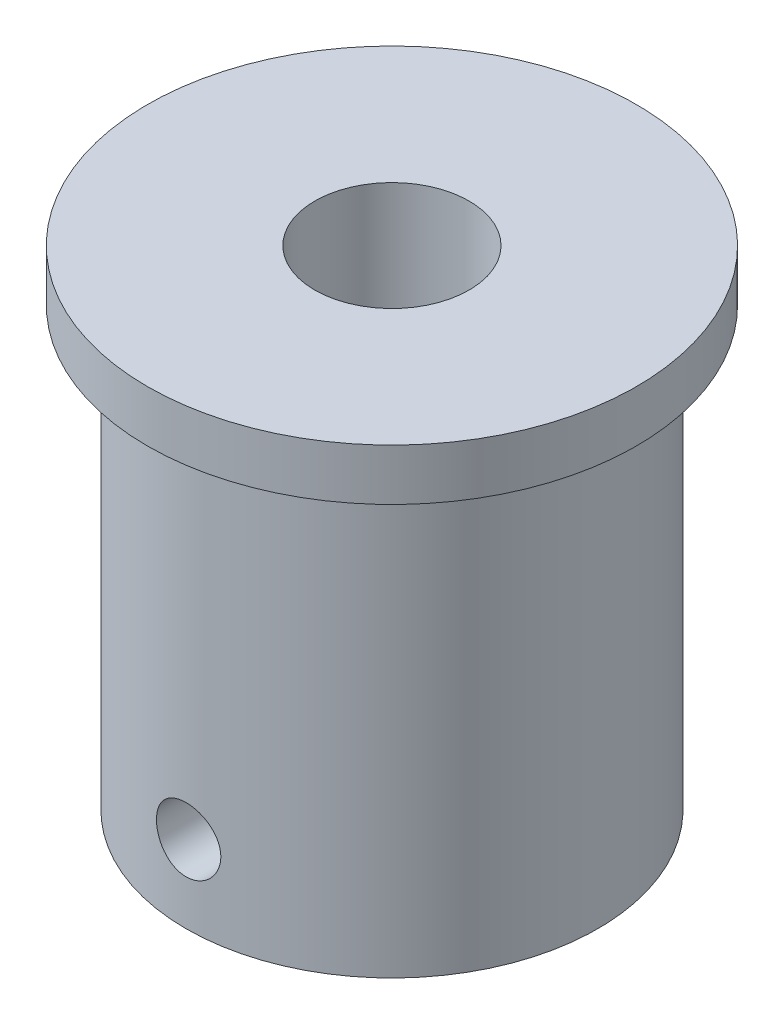
ISO-10303-21;
HEADER;
FILE_DESCRIPTION(('STEP AP214'),'2;1');
FILE_NAME('part.step','',(''),(''),'','','');
FILE_SCHEMA(('AUTOMOTIVE_DESIGN { 1 0 10303 214 1 1 1 1 }'));
ENDSEC;
DATA;
#1=APPLICATION_CONTEXT('core data for automotive mechanical design processes');
#2=APPLICATION_PROTOCOL_DEFINITION('international standard','automotive_design',2000,#1);
#3=PRODUCT_CONTEXT('',#1,'mechanical');
#4=PRODUCT('Part','Part','',(#3));
#5=PRODUCT_RELATED_PRODUCT_CATEGORY('part','',(#4));
#6=PRODUCT_DEFINITION_FORMATION('','',#4);
#7=PRODUCT_DEFINITION_CONTEXT('part definition',#1,'design');
#8=PRODUCT_DEFINITION('design','',#6,#7);
#9=PRODUCT_DEFINITION_SHAPE('','',#8);
#10=(LENGTH_UNIT() NAMED_UNIT(*) SI_UNIT(.MILLI.,.METRE.));
#11=(NAMED_UNIT(*) PLANE_ANGLE_UNIT() SI_UNIT($,.RADIAN.));
#12=(NAMED_UNIT(*) SI_UNIT($,.STERADIAN.) SOLID_ANGLE_UNIT());
#13=UNCERTAINTY_MEASURE_WITH_UNIT(LENGTH_MEASURE(1.E-05),#10,'distance_accuracy_value','');
#14=(GEOMETRIC_REPRESENTATION_CONTEXT(3) GLOBAL_UNCERTAINTY_ASSIGNED_CONTEXT((#13)) GLOBAL_UNIT_ASSIGNED_CONTEXT((#10,
#11,#12)) REPRESENTATION_CONTEXT('',''));
#15=CARTESIAN_POINT('',(0.,0.,0.));
#16=DIRECTION('',(0.,0.,1.));
#17=DIRECTION('',(1.,0.,0.));
#18=AXIS2_PLACEMENT_3D('',#15,#16,#17);
#19=CARTESIAN_POINT('',(0.,8.5,0.));
#20=DIRECTION('',(0.,-1.,0.));
#21=DIRECTION('',(0.,0.,-1.));
#22=AXIS2_PLACEMENT_3D('',#19,#20,#21);
#23=CYLINDRICAL_SURFACE('',#22,4.);
#24=CARTESIAN_POINT('',(0.,2.12499999999999,-4.));
#25=CARTESIAN_POINT('',(-0.0348787743177578,2.12499857543211,-3.99999942548621));
#26=CARTESIAN_POINT('',(-0.0697773512164251,2.1220704715566,-3.99953903121435));
#27=CARTESIAN_POINT('',(-0.138597828744524,2.1104390771808,-3.99774674524398));
#28=CARTESIAN_POINT('',(-0.172518765330827,2.10173027687411,-3.9964140221118));
#29=CARTESIAN_POINT('',(-0.238378134511848,2.07880508429834,-3.99302674291444));
#30=CARTESIAN_POINT('',(-0.270318088072472,2.06459297965959,-3.99097274890793));
#31=CARTESIAN_POINT('',(-0.331355312761145,2.03107536371459,-3.98636948509539));
#32=CARTESIAN_POINT('',(-0.360452952592072,2.01177051424101,-3.98382027965638));
#33=CARTESIAN_POINT('',(-0.415229977912899,1.9684417379115,-3.97848567103589));
#34=CARTESIAN_POINT('',(-0.440881869785655,1.94438325127743,-3.97569862848084));
#35=CARTESIAN_POINT('',(-0.487801922057051,1.89230451293277,-3.97021519032572));
#36=CARTESIAN_POINT('',(-0.509069821635473,1.86428402567495,-3.96751880012687));
#37=CARTESIAN_POINT('',(-0.546726360822202,1.80489043216406,-3.96250607031861));
#38=CARTESIAN_POINT('',(-0.563088183894971,1.77350012940955,-3.96019184946526));
#39=CARTESIAN_POINT('',(-0.590296703992654,1.70837464728555,-3.95622800435591));
#40=CARTESIAN_POINT('',(-0.60114372752515,1.67463960687236,-3.95457834075554));
#41=CARTESIAN_POINT('',(-0.616928898305409,1.60607227471405,-3.95214658627759));
#42=CARTESIAN_POINT('',(-0.62191426371873,1.5712511035453,-3.95135756633091));
#43=CARTESIAN_POINT('',(-0.625980924394045,1.50125820277684,-3.95071542767944));
#44=CARTESIAN_POINT('',(-0.625062587151156,1.46608649513349,-3.95086225072006));
#45=CARTESIAN_POINT('',(-0.617386452022216,1.39672574203683,-3.95206887613802));
#46=CARTESIAN_POINT('',(-0.610681407399224,1.36253069416171,-3.95312043046236));
#47=CARTESIAN_POINT('',(-0.59170484458437,1.29575699841017,-3.95600514086368));
#48=CARTESIAN_POINT('',(-0.579433156710322,1.26317839983987,-3.95783832076603));
#49=CARTESIAN_POINT('',(-0.549617292373453,1.20040282183072,-3.96208876713655));
#50=CARTESIAN_POINT('',(-0.532050930788864,1.17021655205674,-3.96450848271811));
#51=CARTESIAN_POINT('',(-0.492160145366586,1.11320011607862,-3.96965761537525));
#52=CARTESIAN_POINT('',(-0.469835383132534,1.08637018877814,-3.97238705447053));
#53=CARTESIAN_POINT('',(-0.420772722055826,1.03652243834168,-3.97788446562224));
#54=CARTESIAN_POINT('',(-0.393989501401342,1.01354921043264,-3.98065253408898));
#55=CARTESIAN_POINT('',(-0.336924236844835,0.972416713590033,-3.98588781336956));
#56=CARTESIAN_POINT('',(-0.306642175170325,0.954257469110801,-3.98835502265506));
#57=CARTESIAN_POINT('',(-0.243398981764119,0.92326548164441,-3.99271349756759));
#58=CARTESIAN_POINT('',(-0.210436046560112,0.910436360366758,-3.99460437135483));
#59=CARTESIAN_POINT('',(-0.142787383674188,0.890508508138202,-3.99759390000169));
#60=CARTESIAN_POINT('',(-0.108101782671798,0.883409356483388,-3.99869261302244));
#61=CARTESIAN_POINT('',(-0.0383770841909329,0.875202680887461,-3.99996627931819));
#62=CARTESIAN_POINT('',(-0.0033453653771752,0.874033880255964,-4.00015067948215));
#63=CARTESIAN_POINT('',(0.0664136366029097,0.877558176334003,-3.99960071622817));
#64=CARTESIAN_POINT('',(0.101140929981288,0.882251075647286,-3.99886638374911));
#65=CARTESIAN_POINT('',(0.169118361566424,0.897314596920053,-3.99656730923305));
#66=CARTESIAN_POINT('',(0.202375315514008,0.907655189566942,-3.99500696053846));
#67=CARTESIAN_POINT('',(0.266683516964153,0.933688773599706,-3.9912301892089));
#68=CARTESIAN_POINT('',(0.297734653259848,0.949382034610676,-3.98901373352518));
#69=CARTESIAN_POINT('',(0.357018050562597,0.985817997781652,-3.98414743185236));
#70=CARTESIAN_POINT('',(0.385226280945926,1.00659935502263,-3.98149432165855));
#71=CARTESIAN_POINT('',(0.437776741269509,1.05256802147695,-3.97605970116109));
#72=CARTESIAN_POINT('',(0.462118726117538,1.07775560980122,-3.97327818273169));
#73=CARTESIAN_POINT('',(0.50647020194172,1.13209529930431,-3.96787006884162));
#74=CARTESIAN_POINT('',(0.526438496460308,1.16128121178059,-3.96524510297701));
#75=CARTESIAN_POINT('',(0.561188919316593,1.22262901841534,-3.96047673201457));
#76=CARTESIAN_POINT('',(0.575971196945254,1.25479082687237,-3.95833331305499));
#77=CARTESIAN_POINT('',(0.599866929862478,1.32105741017855,-3.95478267838089));
#78=CARTESIAN_POINT('',(0.609001637369772,1.35515436719141,-3.9533727058724));
#79=CARTESIAN_POINT('',(0.62141030510133,1.424422285916,-3.95144142570199));
#80=CARTESIAN_POINT('',(0.624684707712484,1.45959316635475,-3.9509200509611));
#81=CARTESIAN_POINT('',(0.625268631726881,1.52959967897687,-3.95082764511221));
#82=CARTESIAN_POINT('',(0.622642951371054,1.56443477423337,-3.95124629010726));
#83=CARTESIAN_POINT('',(0.611640558139743,1.63316132428607,-3.95296424735458));
#84=CARTESIAN_POINT('',(0.603263857717395,1.66705278112543,-3.95426355769988));
#85=CARTESIAN_POINT('',(0.58102082472962,1.73290945666013,-3.95759272213726));
#86=CARTESIAN_POINT('',(0.567159404346444,1.7648763695646,-3.95962192238352));
#87=CARTESIAN_POINT('',(0.534346921366035,1.82604140341906,-3.96418296011849));
#88=CARTESIAN_POINT('',(0.515395657052207,1.8552394145721,-3.96671481752707));
#89=CARTESIAN_POINT('',(0.472707520347692,1.9103663860317,-3.97202892023065));
#90=CARTESIAN_POINT('',(0.448922767736914,1.93625804915345,-3.97481350290072));
#91=CARTESIAN_POINT('',(0.397343986595504,1.98370530909668,-3.98030010910183));
#92=CARTESIAN_POINT('',(0.369549030196075,2.00525989964796,-3.98300211335031));
#93=CARTESIAN_POINT('',(0.310541714710848,2.04353780575788,-3.98803775614175));
#94=CARTESIAN_POINT('',(0.27930984303559,2.0602313431899,-3.99036908607567));
#95=CARTESIAN_POINT('',(0.214462970589442,2.08811024904823,-3.9943781495972));
#96=CARTESIAN_POINT('',(0.180850444145437,2.09930124313959,-3.9960565503553));
#97=CARTESIAN_POINT('',(0.122578559977896,2.11335825527264,-3.9981936146622));
#98=CARTESIAN_POINT('',(0.0982763939129046,2.11771712265724,-3.9988674790653));
#99=CARTESIAN_POINT('',(0.0493194494626448,2.12353847834476,-3.99977087174405));
#100=CARTESIAN_POINT('',(0.0246646760422793,2.12500100738932,-4.00000040626991));
#101=CARTESIAN_POINT('',(0.,2.12499999999999,-4.));
#102=B_SPLINE_CURVE_WITH_KNOTS('',3,(#24,#25,#26,#27,#28,#29,#30,#31,#32,#33,#34,#35,#36,#37,
#38,#39,#40,#41,#42,#43,#44,#45,#46,#47,#48,#49,#50,#51,#52,#53,#54,#55,#56,#57,#58,#59,#60,#61,
#62,#63,#64,#65,#66,#67,#68,#69,#70,#71,#72,#73,#74,#75,#76,#77,#78,#79,#80,#81,#82,#83,#84,#85,
#86,#87,#88,#89,#90,#91,#92,#93,#94,#95,#96,#97,#98,#99,#100,#101),.UNSPECIFIED.,.T.,.F.,(4,2,2,
2,2,2,2,2,2,2,2,2,2,2,2,2,2,2,2,2,2,2,2,2,2,2,2,2,2,2,2,2,2,2,2,2,2,2,4),(0.,0.104546185119371,
0.209192160632001,0.313756769860253,0.418307796980069,0.523648920380491,0.628996309113545,
0.734909446514387,0.840816312523084,0.945864077837473,1.05090530417635,1.15499894005643,
1.25909574912761,1.36363494350585,1.46818157473015,1.57386433083589,1.67954762378454,
1.78530260938639,1.89104982957464,1.99570213501476,2.10035091632086,2.20444861189139,
2.30855155185504,2.41347135367414,2.5183978040035,2.62427370062394,2.73014654912241,
2.83561852598779,2.9410825405732,3.04539395399668,3.1497051415472,3.2539231174165,
3.35814522417832,3.4634550307888,3.5687892428557,3.67475576049955,3.78061371414065,
3.85454504087879,3.92847532764672),.UNSPECIFIED.);
#103=CARTESIAN_POINT('',(0.,2.12499999999999,-4.));
#104=VERTEX_POINT('',#103);
#105=EDGE_CURVE('E87',#104,#104,#102,.T.);
#106=ORIENTED_EDGE('',*,*,#105,.T.);
#107=EDGE_LOOP('',(#106));
#108=FACE_BOUND('',#107,.T.);
#109=CARTESIAN_POINT('',(-0.624999999999991,1.5,3.95087015731978));
#110=CARTESIAN_POINT('',(-0.624998572948,1.5348758445818,3.95087075873847));
#111=CARTESIAN_POINT('',(-0.622070944357148,1.56977149941112,3.95133695104493));
#112=CARTESIAN_POINT('',(-0.61044160911454,1.63858590724128,3.95314992763416));
#113=CARTESIAN_POINT('',(-0.60173438200455,1.67250369386797,3.95449755381188));
#114=CARTESIAN_POINT('',(-0.578813790117096,1.73835639741442,3.95791712279934));
#115=CARTESIAN_POINT('',(-0.564604787304601,1.77029286196858,3.9599884916785));
#116=CARTESIAN_POINT('',(-0.531094479541159,1.83132422270963,3.96462147456817));
#117=CARTESIAN_POINT('',(-0.511793829012849,1.86041948341464,3.96718302556462));
#118=CARTESIAN_POINT('',(-0.468469325277216,1.91519912128805,3.97253259628578));
#119=CARTESIAN_POINT('',(-0.444409971543728,1.94085526859997,3.97532221960949));
#120=CARTESIAN_POINT('',(-0.392327702469187,1.98778355510741,3.98079932706868));
#121=CARTESIAN_POINT('',(-0.364304563292119,2.00905544655605,3.98348680542514));
#122=CARTESIAN_POINT('',(-0.304908572964394,2.0467162192603,3.98847366788234));
#123=CARTESIAN_POINT('',(-0.273518981589317,2.06307900099361,3.99077095040844));
#124=CARTESIAN_POINT('',(-0.208395042948687,2.09028948868126,3.99470078727639));
#125=CARTESIAN_POINT('',(-0.1746608300342,2.10113751034566,3.99633337966949));
#126=CARTESIAN_POINT('',(-0.106096331362201,2.11692467973903,3.99873857144929));
#127=CARTESIAN_POINT('',(-0.0712771900401862,2.12191116226708,3.99951805651261));
#128=CARTESIAN_POINT('',(-0.00128828588766717,2.12598076082583,4.00015282745238));
#129=CARTESIAN_POINT('',(0.0338814557472968,2.12506423158795,4.00000816886367));
#130=CARTESIAN_POINT('',(0.103250022430537,2.11739101843053,3.99881643474671));
#131=CARTESIAN_POINT('',(0.137454635643792,2.11068526528991,3.99777722923995));
#132=CARTESIAN_POINT('',(0.20424709383587,2.09170399284434,3.99492193488821));
#133=CARTESIAN_POINT('',(0.236834894338041,2.07942832041146,3.99310582468468));
#134=CARTESIAN_POINT('',(0.299621856698114,2.04960408603498,3.9888872960507));
#135=CARTESIAN_POINT('',(0.329810747679588,2.032034248643,3.98648251942604));
#136=CARTESIAN_POINT('',(0.386830964133028,1.99213597984268,3.98135436755115));
#137=CARTESIAN_POINT('',(0.413662049898304,1.96980720901125,3.97863096958204));
#138=CARTESIAN_POINT('',(0.463505496300052,1.92074162823168,3.97313469563891));
#139=CARTESIAN_POINT('',(0.48647406403268,1.89396033340128,3.97036160177552));
#140=CARTESIAN_POINT('',(0.527598065118706,1.83690060882946,3.96510673461186));
#141=CARTESIAN_POINT('',(0.54575346384583,1.80662215393148,3.96262496340745));
#142=CARTESIAN_POINT('',(0.576742651589205,1.74338009297355,3.95823373204033));
#143=CARTESIAN_POINT('',(0.589571659710393,1.71041410623163,3.95632478646223));
#144=CARTESIAN_POINT('',(0.609498357819162,1.64275878782363,3.9533042247737));
#145=CARTESIAN_POINT('',(0.616596487988135,1.60806958873257,3.95219254742686));
#146=CARTESIAN_POINT('',(0.624799298094631,1.5383429741812,3.95090409242215));
#147=CARTESIAN_POINT('',(0.625966183528168,1.50331304995131,3.95071761201499));
#148=CARTESIAN_POINT('',(0.622438697582951,1.43355809117552,3.95127487442955));
#149=CARTESIAN_POINT('',(0.617744524135812,1.39883304637354,3.95201858583811));
#150=CARTESIAN_POINT('',(0.60268103138973,1.33086804813338,3.95434350262964));
#151=CARTESIAN_POINT('',(0.592342946954939,1.2976210003401,3.95592009708338));
#152=CARTESIAN_POINT('',(0.566317680604821,1.23333150722403,3.95972931099212));
#153=CARTESIAN_POINT('',(0.550630214007365,1.20228917933775,3.96196196536028));
#154=CARTESIAN_POINT('',(0.514202997925726,1.1430121795878,3.96685448051778));
#155=CARTESIAN_POINT('',(0.49342312773367,1.11480244277501,3.96951767364941));
#156=CARTESIAN_POINT('',(0.4474564849882,1.06224825478795,3.97496126174052));
#157=CARTESIAN_POINT('',(0.422269441303544,1.03790404159825,3.97774166390276));
#158=CARTESIAN_POINT('',(0.367928866914514,0.99354718234114,3.98313684718638));
#159=CARTESIAN_POINT('',(0.338741410397453,0.97357585589249,3.98574989605411));
#160=CARTESIAN_POINT('',(0.277389652573338,0.938820120002449,3.99048872335209));
#161=CARTESIAN_POINT('',(0.245225438290618,0.924035558988522,3.99261451602077));
#162=CARTESIAN_POINT('',(0.178959915944578,0.900138431178971,3.99613174419209));
#163=CARTESIAN_POINT('',(0.144866786904269,0.891003625640157,3.9975260556393));
#164=CARTESIAN_POINT('',(0.0756069874426842,0.878593466831806,3.99943532447363));
#165=CARTESIAN_POINT('',(0.0404403944136067,0.875317692161017,3.99995034510219));
#166=CARTESIAN_POINT('',(-0.0295680412970693,0.874729536836206,4.00004227531993));
#167=CARTESIAN_POINT('',(-0.06440935721495,0.877354063839324,3.99962911009997));
#168=CARTESIAN_POINT('',(-0.133148648866217,0.888356329045091,3.99793119503565));
#169=CARTESIAN_POINT('',(-0.167046628395397,0.896734044094591,3.99664644869889));
#170=CARTESIAN_POINT('',(-0.23291721260736,0.918981814928122,3.99334910355371));
#171=CARTESIAN_POINT('',(-0.264891449129104,0.932847137895329,3.99133713207387));
#172=CARTESIAN_POINT('',(-0.326069518132999,0.965669709630425,3.98680583077864));
#173=CARTESIAN_POINT('',(-0.355273245363476,0.98462715174323,3.98428648169931));
#174=CARTESIAN_POINT('',(-0.410400547964671,1.02732236080244,3.9789882055598));
#175=CARTESIAN_POINT('',(-0.436287923706618,1.05110657857727,3.97620690885482));
#176=CARTESIAN_POINT('',(-0.483726781841738,1.1026824893326,3.97071532194319));
#177=CARTESIAN_POINT('',(-0.505277246405195,1.13047512042651,3.9680050485345));
#178=CARTESIAN_POINT('',(-0.543550378855934,1.18948027607285,3.96294449366009));
#179=CARTESIAN_POINT('',(-0.560242610370711,1.22071273966855,3.96059652327367));
#180=CARTESIAN_POINT('',(-0.588118914018709,1.28556080442378,3.95655358364792));
#181=CARTESIAN_POINT('',(-0.599308625148002,1.31917392528346,3.95485794628578));
#182=CARTESIAN_POINT('',(-0.61336226739316,1.37744243492178,3.95269774170847));
#183=CARTESIAN_POINT('',(-0.617719623188423,1.40174039999532,3.95201609495364));
#184=CARTESIAN_POINT('',(-0.623538972697047,1.45068894526249,3.95110209343873));
#185=CARTESIAN_POINT('',(-0.625001009059045,1.47533952025672,3.95086973206058));
#186=CARTESIAN_POINT('',(-0.624999999999991,1.5,3.95087015731978));
#187=B_SPLINE_CURVE_WITH_KNOTS('',3,(#109,#110,#111,#112,#113,#114,#115,#116,#117,#118,#119,
#120,#121,#122,#123,#124,#125,#126,#127,#128,#129,#130,#131,#132,#133,#134,#135,#136,#137,#138,
#139,#140,#141,#142,#143,#144,#145,#146,#147,#148,#149,#150,#151,#152,#153,#154,#155,#156,#157,
#158,#159,#160,#161,#162,#163,#164,#165,#166,#167,#168,#169,#170,#171,#172,#173,#174,#175,#176,
#177,#178,#179,#180,#181,#182,#183,#184,#185,#186),.UNSPECIFIED.,.T.,.F.,(4,2,2,2,2,2,2,2,2,2,2,
2,2,2,2,2,2,2,2,2,2,2,2,2,2,2,2,2,2,2,2,2,2,2,2,2,2,2,4),(0.,0.104537381970645,
0.209174758133978,0.31372934410309,0.418270498353513,0.523623145118166,0.628981743551656,
0.734890945046189,0.840794082746883,0.94583599378424,1.05087159256626,1.15499244786741,
1.25911616582688,1.36366403231752,1.46821935800935,1.57389010847866,1.67956161913007,
1.78532777508706,1.89108580650806,1.99573235007658,2.10037535976159,2.20444503362053,
2.30852024669882,2.41344338208288,2.51837297465504,2.62425492998863,2.7301337908824,
2.83559319057102,2.94104500495905,3.04537458517292,3.14970374552498,3.25394312202836,
3.35818645700216,3.46348510099494,3.5688084287814,3.67477805414634,3.78063885408466,
3.85455763643561,3.92847532993996),.UNSPECIFIED.);
#188=CARTESIAN_POINT('',(-0.624999999999991,1.5,3.95087015731978));
#189=VERTEX_POINT('',#188);
#190=EDGE_CURVE('E82',#189,#189,#187,.T.);
#191=ORIENTED_EDGE('',*,*,#190,.T.);
#192=EDGE_LOOP('',(#191));
#193=FACE_BOUND('',#192,.T.);
#194=CARTESIAN_POINT('',(0.,8.5,0.));
#195=DIRECTION('',(0.,1.,0.));
#196=DIRECTION('',(0.,0.,1.));
#197=AXIS2_PLACEMENT_3D('',#194,#195,#196);
#198=CIRCLE('',#197,4.);
#199=CARTESIAN_POINT('',(0.,8.5,4.));
#200=VERTEX_POINT('',#199);
#201=EDGE_CURVE('E10',#200,#200,#198,.T.);
#202=ORIENTED_EDGE('',*,*,#201,.F.);
#203=EDGE_LOOP('',(#202));
#204=FACE_BOUND('',#203,.T.);
#205=CARTESIAN_POINT('',(0.,0.,0.));
#206=DIRECTION('',(0.,1.,0.));
#207=DIRECTION('',(0.,0.,1.));
#208=AXIS2_PLACEMENT_3D('',#205,#206,#207);
#209=CIRCLE('',#208,4.);
#210=CARTESIAN_POINT('',(0.,0.,4.));
#211=VERTEX_POINT('',#210);
#212=EDGE_CURVE('E54',#211,#211,#209,.T.);
#213=ORIENTED_EDGE('',*,*,#212,.T.);
#214=EDGE_LOOP('',(#213));
#215=FACE_BOUND('',#214,.T.);
#216=ADVANCED_FACE('F41',(#108,#193,#204,#215),#23,.T.);
#217=CARTESIAN_POINT('',(0.,0.,0.));
#218=DIRECTION('',(0.,1.,0.));
#219=DIRECTION('',(0.,0.,1.));
#220=AXIS2_PLACEMENT_3D('',#217,#218,#219);
#221=PLANE('',#220);
#222=CARTESIAN_POINT('',(0.,0.,0.));
#223=DIRECTION('',(0.,1.,0.));
#224=DIRECTION('',(0.,0.,1.));
#225=AXIS2_PLACEMENT_3D('',#222,#223,#224);
#226=CIRCLE('',#225,1.5);
#227=CARTESIAN_POINT('',(0.,0.,1.5));
#228=VERTEX_POINT('',#227);
#229=EDGE_CURVE('E94',#228,#228,#226,.T.);
#230=ORIENTED_EDGE('',*,*,#229,.T.);
#231=EDGE_LOOP('',(#230));
#232=FACE_BOUND('',#231,.T.);
#233=ORIENTED_EDGE('',*,*,#212,.F.);
#234=EDGE_LOOP('',(#233));
#235=FACE_BOUND('',#234,.T.);
#236=ADVANCED_FACE('F118',(#232,#235),#221,.F.);
#237=CARTESIAN_POINT('',(0.,9.5,0.));
#238=DIRECTION('',(0.,-1.,0.));
#239=DIRECTION('',(0.,0.,-1.));
#240=AXIS2_PLACEMENT_3D('',#237,#238,#239);
#241=CYLINDRICAL_SURFACE('',#240,4.75);
#242=CARTESIAN_POINT('',(0.,9.5,0.));
#243=DIRECTION('',(0.,1.,0.));
#244=DIRECTION('',(0.,0.,1.));
#245=AXIS2_PLACEMENT_3D('',#242,#243,#244);
#246=CIRCLE('',#245,4.75);
#247=CARTESIAN_POINT('',(0.,9.5,4.75));
#248=VERTEX_POINT('',#247);
#249=EDGE_CURVE('E59',#248,#248,#246,.T.);
#250=ORIENTED_EDGE('',*,*,#249,.F.);
#251=EDGE_LOOP('',(#250));
#252=FACE_BOUND('',#251,.T.);
#253=CARTESIAN_POINT('',(0.,8.5,0.));
#254=DIRECTION('',(0.,1.,0.));
#255=DIRECTION('',(0.,0.,1.));
#256=AXIS2_PLACEMENT_3D('',#253,#254,#255);
#257=CIRCLE('',#256,4.75);
#258=CARTESIAN_POINT('',(0.,8.5,4.75));
#259=VERTEX_POINT('',#258);
#260=EDGE_CURVE('E62',#259,#259,#257,.T.);
#261=ORIENTED_EDGE('',*,*,#260,.T.);
#262=EDGE_LOOP('',(#261));
#263=FACE_BOUND('',#262,.T.);
#264=ADVANCED_FACE('F104',(#252,#263),#241,.T.);
#265=CARTESIAN_POINT('',(0.,9.5,0.));
#266=DIRECTION('',(0.,1.,0.));
#267=DIRECTION('',(0.,0.,1.));
#268=AXIS2_PLACEMENT_3D('',#265,#266,#267);
#269=PLANE('',#268);
#270=CARTESIAN_POINT('',(0.,9.5,0.));
#271=DIRECTION('',(0.,1.,0.));
#272=DIRECTION('',(0.,0.,1.));
#273=AXIS2_PLACEMENT_3D('',#270,#271,#272);
#274=CIRCLE('',#273,1.5);
#275=CARTESIAN_POINT('',(0.,9.5,1.5));
#276=VERTEX_POINT('',#275);
#277=EDGE_CURVE('E93',#276,#276,#274,.T.);
#278=ORIENTED_EDGE('',*,*,#277,.F.);
#279=EDGE_LOOP('',(#278));
#280=FACE_BOUND('',#279,.T.);
#281=ORIENTED_EDGE('',*,*,#249,.T.);
#282=EDGE_LOOP('',(#281));
#283=FACE_BOUND('',#282,.T.);
#284=ADVANCED_FACE('F108',(#280,#283),#269,.T.);
#285=CARTESIAN_POINT('',(0.,8.5,0.));
#286=DIRECTION('',(0.,1.,0.));
#287=DIRECTION('',(0.,0.,1.));
#288=AXIS2_PLACEMENT_3D('',#285,#286,#287);
#289=PLANE('',#288);
#290=ORIENTED_EDGE('',*,*,#201,.T.);
#291=EDGE_LOOP('',(#290));
#292=FACE_BOUND('',#291,.T.);
#293=ORIENTED_EDGE('',*,*,#260,.F.);
#294=EDGE_LOOP('',(#293));
#295=FACE_BOUND('',#294,.T.);
#296=ADVANCED_FACE('F106',(#292,#295),#289,.F.);
#297=CARTESIAN_POINT('',(0.,0.,0.));
#298=DIRECTION('',(0.,1.,0.));
#299=DIRECTION('',(0.,0.,1.));
#300=AXIS2_PLACEMENT_3D('',#297,#298,#299);
#301=CYLINDRICAL_SURFACE('',#300,1.5);
#302=CARTESIAN_POINT('',(0.,0.875000000000009,1.5));
#303=CARTESIAN_POINT('',(0.033479026318133,0.875003602545658,1.49999729183636));
#304=CARTESIAN_POINT('',(0.0670106985319196,0.877705979264076,1.49886616487355));
#305=CARTESIAN_POINT('',(0.133123685578172,0.888419532460098,1.49445076789776));
#306=CARTESIAN_POINT('',(0.16570228821178,0.896444562232133,1.49116087950514));
#307=CARTESIAN_POINT('',(0.228844366826541,0.917455545890303,1.48278144519064));
#308=CARTESIAN_POINT('',(0.259414262213131,0.930424694734082,1.47769799987502));
#309=CARTESIAN_POINT('',(0.317914878339897,0.960886411616291,1.46622643235332));
#310=CARTESIAN_POINT('',(0.345846395007965,0.97837760948544,1.45983870546425));
#311=CARTESIAN_POINT('',(0.399724201779751,1.01831449129545,1.44603914175935));
#312=CARTESIAN_POINT('',(0.425520633758879,1.04095065439488,1.43859376663047));
#313=CARTESIAN_POINT('',(0.473079910545625,1.09013216739129,1.42366357034257));
#314=CARTESIAN_POINT('',(0.494840631576536,1.11667956244726,1.41617873053405));
#315=CARTESIAN_POINT('',(0.534768688485321,1.17451338878245,1.40160510906498));
#316=CARTESIAN_POINT('',(0.552706540769618,1.20596872421328,1.39455393436693));
#317=CARTESIAN_POINT('',(0.582969702944321,1.27178662896047,1.38217786178503));
#318=CARTESIAN_POINT('',(0.595297904181446,1.30614768974223,1.37685207500412));
#319=CARTESIAN_POINT('',(0.613372991560786,1.37507684588396,1.36889277693853));
#320=CARTESIAN_POINT('',(0.61940828938802,1.40955524169608,1.36614193825894));
#321=CARTESIAN_POINT('',(0.625626049838973,1.47913664634329,1.36330663109752));
#322=CARTESIAN_POINT('',(0.625811740271978,1.51423930001287,1.3632206921263));
#323=CARTESIAN_POINT('',(0.620542251818361,1.58120003021747,1.36562559780427));
#324=CARTESIAN_POINT('',(0.615518405561495,1.61310054828223,1.36791941361812));
#325=CARTESIAN_POINT('',(0.600695955078874,1.67555604550019,1.37449241386899));
#326=CARTESIAN_POINT('',(0.590896436435876,1.70611076574588,1.37877197851782));
#327=CARTESIAN_POINT('',(0.566609793637847,1.76577885149572,1.38893092386379));
#328=CARTESIAN_POINT('',(0.552027357696172,1.79484771045669,1.39484240974568));
#329=CARTESIAN_POINT('',(0.518656212902804,1.85023886694007,1.40759165570543));
#330=CARTESIAN_POINT('',(0.499865845259764,1.87656007530676,1.4144297806489));
#331=CARTESIAN_POINT('',(0.45674798277191,1.92804997936641,1.4289648843899));
#332=CARTESIAN_POINT('',(0.432086741603756,1.95293328369271,1.43668560702237));
#333=CARTESIAN_POINT('',(0.37886479552575,1.99830675147959,1.45162836556265));
#334=CARTESIAN_POINT('',(0.350303179724222,2.01879588584608,1.45885028438505));
#335=CARTESIAN_POINT('',(0.289223974346683,2.05521791180813,1.47219141778237));
#336=CARTESIAN_POINT('',(0.256630291223835,2.07103472257533,1.47828133271667));
#337=CARTESIAN_POINT('',(0.188926201263412,2.09686056980162,1.48844740707402));
#338=CARTESIAN_POINT('',(0.153817197397514,2.1068728159719,1.49252467922899));
#339=CARTESIAN_POINT('',(0.084464056673111,2.12020799606331,1.49799820593193));
#340=CARTESIAN_POINT('',(0.0503056426393158,2.12391392872186,1.49954770523565));
#341=CARTESIAN_POINT('',(-0.0181773277480442,2.12567311180704,1.5002802518437));
#342=CARTESIAN_POINT('',(-0.0525018335763125,2.123727985126,1.4994639785596));
#343=CARTESIAN_POINT('',(-0.118549121170723,2.11451445759695,1.49565608828479));
#344=CARTESIAN_POINT('',(-0.150316483319714,2.10751502295135,1.49277443642026));
#345=CARTESIAN_POINT('',(-0.212191374485523,2.08876590272964,1.48524303386176));
#346=CARTESIAN_POINT('',(-0.2422986932591,2.07701561702499,1.48059305979735));
#347=CARTESIAN_POINT('',(-0.301054499934648,2.04871451214378,1.46979135322704));
#348=CARTESIAN_POINT('',(-0.329628618427969,2.0320259084264,1.46359745735098));
#349=CARTESIAN_POINT('',(-0.383673108115401,1.99447331110472,1.45036902289088));
#350=CARTESIAN_POINT('',(-0.409142176299808,1.97360757423752,1.44333413382659));
#351=CARTESIAN_POINT('',(-0.458166715138369,1.92654838336147,1.42856043949549));
#352=CARTESIAN_POINT('',(-0.4814553489947,1.90008074849792,1.42080725802571));
#353=CARTESIAN_POINT('',(-0.52333492304796,1.84348936204124,1.40592168376945));
#354=CARTESIAN_POINT('',(-0.541924796410166,1.81336478244758,1.39878943220316));
#355=CARTESIAN_POINT('',(-0.57407980105764,1.74969291232273,1.38590693148935));
#356=CARTESIAN_POINT('',(-0.587569591248212,1.71610298213177,1.38017781378463));
#357=CARTESIAN_POINT('',(-0.60858706982031,1.64681470297968,1.37104177929792));
#358=CARTESIAN_POINT('',(-0.61611967433468,1.6111181187234,1.36763294803744));
#359=CARTESIAN_POINT('',(-0.624520401730675,1.54159065042286,1.36381582244702));
#360=CARTESIAN_POINT('',(-0.625856902061941,1.5078276688597,1.3631967547718));
#361=CARTESIAN_POINT('',(-0.623077877623249,1.44057856942344,1.36446926511913));
#362=CARTESIAN_POINT('',(-0.618963189824567,1.40709240984158,1.36636045771831));
#363=CARTESIAN_POINT('',(-0.605792023901524,1.34295362626706,1.37224775649535));
#364=CARTESIAN_POINT('',(-0.596974517857074,1.31224166326871,1.37614177422811));
#365=CARTESIAN_POINT('',(-0.574881641010912,1.25272598932098,1.38551590600024));
#366=CARTESIAN_POINT('',(-0.561605017586319,1.2239228173005,1.39099646565965));
#367=CARTESIAN_POINT('',(-0.530051429677366,1.16715205202556,1.40333477279882));
#368=CARTESIAN_POINT('',(-0.511521804552388,1.13933883491589,1.41025551356806));
#369=CARTESIAN_POINT('',(-0.470342036315206,1.08706993031963,1.42451844526954));
#370=CARTESIAN_POINT('',(-0.447690464452806,1.06261541219971,1.43186078172947));
#371=CARTESIAN_POINT('',(-0.396951022889397,1.01592565915764,1.44678196425043));
#372=CARTESIAN_POINT('',(-0.368587369974504,0.993981783579682,1.45433908755893));
#373=CARTESIAN_POINT('',(-0.308300039626594,0.95515027322819,1.46830071811013));
#374=CARTESIAN_POINT('',(-0.276374748972866,0.938264942555228,1.47470469958371));
#375=CARTESIAN_POINT('',(-0.210366028358968,0.910395077280065,1.4855459168123));
#376=CARTESIAN_POINT('',(-0.176326995490312,0.899317616691358,1.49001391290982));
#377=CARTESIAN_POINT('',(-0.106705210923274,0.88314683546109,1.49660504884313));
#378=CARTESIAN_POINT('',(-0.0711276584904743,0.878034778735066,1.49873552905983));
#379=CARTESIAN_POINT('',(-0.0236180409595891,0.875333419456785,1.49986143784467));
#380=CARTESIAN_POINT('',(-0.0118122973378273,0.874998728925397,1.50000095551268));
#381=CARTESIAN_POINT('',(0.,0.875000000000009,1.5));
#382=B_SPLINE_CURVE_WITH_KNOTS('',3,(#302,#303,#304,#305,#306,#307,#308,#309,#310,#311,#312,
#313,#314,#315,#316,#317,#318,#319,#320,#321,#322,#323,#324,#325,#326,#327,#328,#329,#330,#331,
#332,#333,#334,#335,#336,#337,#338,#339,#340,#341,#342,#343,#344,#345,#346,#347,#348,#349,#350,
#351,#352,#353,#354,#355,#356,#357,#358,#359,#360,#361,#362,#363,#364,#365,#366,#367,#368,#369,
#370,#371,#372,#373,#374,#375,#376,#377,#378,#379,#380,#381),.UNSPECIFIED.,.T.,.F.,(4,2,2,2,2,2,
2,2,2,2,2,2,2,2,2,2,2,2,2,2,2,2,2,2,2,2,2,2,2,2,2,2,2,2,2,2,2,2,2,4),(0.,0.100403459441968,
0.201069270314346,0.301395925953147,0.401692218426482,0.506589681444029,0.611542190657319,
0.721658622695617,0.831718233652929,0.936476365687775,1.04117669124522,1.13785078601277,
1.23454339863605,1.33329356529356,1.43208272858601,1.53922070563946,1.64638374657292,
1.75602027530404,1.86559612109146,1.96824221696623,2.07085883746583,2.16838294867858,
2.2659193830089,2.36648567636077,2.46709402734745,2.57489244014644,2.68271530620167,
2.79207394177044,2.90134223531375,3.00219938773906,3.10304105642853,3.19918824976465,
3.2953624746939,3.39731946692805,3.49931186707056,3.60873267496528,3.71820324708375,
3.82586427903776,3.93318625228744,3.96861128243632),.UNSPECIFIED.);
#383=CARTESIAN_POINT('',(0.,0.875000000000009,1.5));
#384=VERTEX_POINT('',#383);
#385=EDGE_CURVE('E45',#384,#384,#382,.T.);
#386=ORIENTED_EDGE('',*,*,#385,.T.);
#387=EDGE_LOOP('',(#386));
#388=FACE_BOUND('',#387,.T.);
#389=CARTESIAN_POINT('',(-0.624999999999991,1.5,-1.36358901432947));
#390=CARTESIAN_POINT('',(-0.624996295332829,1.53333594544843,-1.3635925978161));
#391=CARTESIAN_POINT('',(-0.622316019407505,1.56672632841311,-1.36482929767201));
#392=CARTESIAN_POINT('',(-0.611698394738915,1.63254347102857,-1.36961916825442));
#393=CARTESIAN_POINT('',(-0.603746770016374,1.66496736333762,-1.37317862912134));
#394=CARTESIAN_POINT('',(-0.582949942097245,1.72778056484553,-1.38213458787384));
#395=CARTESIAN_POINT('',(-0.570124687157131,1.75817758185751,-1.38752358781308));
#396=CARTESIAN_POINT('',(-0.540003188772305,1.81637972478902,-1.39952074282897));
#397=CARTESIAN_POINT('',(-0.522708002957648,1.84418546171656,-1.40612860940392));
#398=CARTESIAN_POINT('',(-0.482986941338076,1.89816286248673,-1.42027881309929));
#399=CARTESIAN_POINT('',(-0.460326619092197,1.92415377937204,-1.42785284039573));
#400=CARTESIAN_POINT('',(-0.411010837872768,1.97210011124877,-1.44282147686114));
#401=CARTESIAN_POINT('',(-0.384353845686996,1.9940539703065,-1.45021601590395));
#402=CARTESIAN_POINT('',(-0.326381696898669,2.03422476543963,-1.46437768965307));
#403=CARTESIAN_POINT('',(-0.294914646841824,2.05223831401617,-1.47110369987646));
#404=CARTESIAN_POINT('',(-0.229066011181172,2.08263801025279,-1.48278259996713));
#405=CARTESIAN_POINT('',(-0.194685727436058,2.0950266559821,-1.48773627673578));
#406=CARTESIAN_POINT('',(-0.12588424901258,2.11316972937836,-1.49508760521183));
#407=CARTESIAN_POINT('',(-0.0915582880980381,2.11923584745101,-1.49760485563733));
#408=CARTESIAN_POINT('',(-0.0222895901825018,2.12556882057992,-1.50023414305602));
#409=CARTESIAN_POINT('',(0.0126528908822589,2.12583802794147,-1.50034715565507));
#410=CARTESIAN_POINT('',(0.0798963900562838,2.12073285953333,-1.49822564566528));
#411=CARTESIAN_POINT('',(0.112228744303656,2.11570094973713,-1.49613357324332));
#412=CARTESIAN_POINT('',(0.175541446965727,2.10072344868091,-1.49003258375154));
#413=CARTESIAN_POINT('',(0.206521695527456,2.09077749518491,-1.48602352537288));
#414=CARTESIAN_POINT('',(0.26681905903876,2.06613597955267,-1.47639926207014));
#415=CARTESIAN_POINT('',(0.29610358853745,2.05137026856458,-1.47076048563043));
#416=CARTESIAN_POINT('',(0.351855883640978,2.01757712164982,-1.45842856994903));
#417=CARTESIAN_POINT('',(0.378322648878483,1.9985481795775,-1.45173505833128));
#418=CARTESIAN_POINT('',(0.429670455853957,1.95520878979768,-1.43740849388531));
#419=CARTESIAN_POINT('',(0.454308218658115,1.93062060436049,-1.42974247178005));
#420=CARTESIAN_POINT('',(0.499215707463828,1.8776442796467,-1.41468930340735));
#421=CARTESIAN_POINT('',(0.519483747912151,1.84925468085395,-1.40730226565685));
#422=CARTESIAN_POINT('',(0.55570094625031,1.78830248166904,-1.39340806177669));
#423=CARTESIAN_POINT('',(0.571486266777694,1.75563339712835,-1.38693779278357));
#424=CARTESIAN_POINT('',(0.59723216029195,1.68775947751275,-1.37604922110506));
#425=CARTESIAN_POINT('',(0.607196898136557,1.65255647586522,-1.37162945167297));
#426=CARTESIAN_POINT('',(0.620400125840597,1.583051595543,-1.36570606259862));
#427=CARTESIAN_POINT('',(0.624033073164321,1.54883943887047,-1.36403184598559));
#428=CARTESIAN_POINT('',(0.625628152594984,1.48026075879425,-1.36330143405321));
#429=CARTESIAN_POINT('',(0.623592246590737,1.44589429290414,-1.3642443329966));
#430=CARTESIAN_POINT('',(0.614267387827772,1.38030080728478,-1.36846565672875));
#431=CARTESIAN_POINT('',(0.607323094090233,1.3490136566066,-1.37159069008309));
#432=CARTESIAN_POINT('',(0.588835292821118,1.28807435175107,-1.37962815148724));
#433=CARTESIAN_POINT('',(0.577290710265615,1.25842258158465,-1.38454099730081));
#434=CARTESIAN_POINT('',(0.549387604025924,1.20019234482177,-1.395853989285));
#435=CARTESIAN_POINT('',(0.53284591653098,1.17171251269484,-1.40230831101141));
#436=CARTESIAN_POINT('',(0.495600392192977,1.11779597375049,-1.41590001870397));
#437=CARTESIAN_POINT('',(0.474894753937985,1.09236059164907,-1.42303769960292));
#438=CARTESIAN_POINT('',(0.427922227857745,1.043099932558,-1.43789309892266));
#439=CARTESIAN_POINT('',(0.401339830739862,1.01957430002468,-1.44561073354421));
#440=CARTESIAN_POINT('',(0.344425756276763,0.977263854010341,-1.46021680591962));
#441=CARTESIAN_POINT('',(0.314093804401822,0.958479387968156,-1.46710518288507));
#442=CARTESIAN_POINT('',(0.250327340401686,0.926205062278219,-1.47932125792825));
#443=CARTESIAN_POINT('',(0.216885084819248,0.912728879355268,-1.48464491569413));
#444=CARTESIAN_POINT('',(0.147929417577204,0.891691603832793,-1.49309086551683));
#445=CARTESIAN_POINT('',(0.112417252112594,0.884126990886975,-1.4962144675996));
#446=CARTESIAN_POINT('',(0.0430082667532025,0.875570937239855,-1.49975767398755));
#447=CARTESIAN_POINT('',(0.00917204239694628,0.874157000151527,-1.50035102267113));
#448=CARTESIAN_POINT('',(-0.0582434058571443,0.876806570646979,-1.49924761740476));
#449=CARTESIAN_POINT('',(-0.0918226737705787,0.880869118006443,-1.49755126492157));
#450=CARTESIAN_POINT('',(-0.156543241224593,0.89405303607934,-1.49215032990867));
#451=CARTESIAN_POINT('',(-0.187728768921784,0.902989840234785,-1.48851912104617));
#452=CARTESIAN_POINT('',(-0.248146115250664,0.925467123604574,-1.47964749923529));
#453=CARTESIAN_POINT('',(-0.277377561492912,0.939008477332461,-1.47440678062103));
#454=CARTESIAN_POINT('',(-0.334512282739389,0.970994764607241,-1.46252912699331));
#455=CARTESIAN_POINT('',(-0.362295828988338,0.989633650712005,-1.45583979594383));
#456=CARTESIAN_POINT('',(-0.414459337819387,1.03100359143595,-1.44185780937115));
#457=CARTESIAN_POINT('',(-0.438838030893017,1.05373616520338,-1.43456493041899));
#458=CARTESIAN_POINT('',(-0.485224893615786,1.10447241292721,-1.4195742262957));
#459=CARTESIAN_POINT('',(-0.50695887682423,1.13272950731057,-1.41188261428948));
#460=CARTESIAN_POINT('',(-0.545416661533366,1.1927293703401,-1.39747776345093));
#461=CARTESIAN_POINT('',(-0.562137662283768,1.22447407402908,-1.39076507261279));
#462=CARTESIAN_POINT('',(-0.589913830217878,1.29047191751138,-1.37921278866321));
#463=CARTESIAN_POINT('',(-0.600999118164261,1.32471057939661,-1.37436327234933));
#464=CARTESIAN_POINT('',(-0.617117782268997,1.39476978692534,-1.36720401533334));
#465=CARTESIAN_POINT('',(-0.622171457606042,1.43058460363715,-1.36488575802491));
#466=CARTESIAN_POINT('',(-0.62470232461824,1.47767926213095,-1.36372489866344));
#467=CARTESIAN_POINT('',(-0.625001240605583,1.48883657869402,-1.36358781430438));
#468=CARTESIAN_POINT('',(-0.624999999999991,1.5,-1.36358901432947));
#469=B_SPLINE_CURVE_WITH_KNOTS('',3,(#389,#390,#391,#392,#393,#394,#395,#396,#397,#398,#399,
#400,#401,#402,#403,#404,#405,#406,#407,#408,#409,#410,#411,#412,#413,#414,#415,#416,#417,#418,
#419,#420,#421,#422,#423,#424,#425,#426,#427,#428,#429,#430,#431,#432,#433,#434,#435,#436,#437,
#438,#439,#440,#441,#442,#443,#444,#445,#446,#447,#448,#449,#450,#451,#452,#453,#454,#455,#456,
#457,#458,#459,#460,#461,#462,#463,#464,#465,#466,#467,#468),.UNSPECIFIED.,.T.,.F.,(4,2,2,2,2,2,
2,2,2,2,2,2,2,2,2,2,2,2,2,2,2,2,2,2,2,2,2,2,2,2,2,2,2,2,2,2,2,2,2,4),(0.,0.0999758559927562,
0.200223580921085,0.300065326076052,0.399883469275045,0.505334207153263,0.610825502299545,
0.720892382889611,0.830910333874445,0.935203029889748,1.03945340458964,1.13735920122545,
1.2352722160094,1.33467907320031,1.4341211051124,1.5405726592224,1.64706520220681,
1.75705772833359,1.86697145372782,1.96975389153151,2.07250076259222,2.16866950533093,
2.26486073456762,2.36512563409081,2.4654340039773,2.57390831367753,2.6823905702093,
2.79115052977794,2.899845673215,3.00094317547023,3.10202295400953,3.1995170751824,
3.29702972316082,3.39894931414514,3.50090680524448,3.60980213454034,3.7187581906959,
3.82712562898428,3.93512732273076,3.96860687718347),.UNSPECIFIED.);
#470=CARTESIAN_POINT('',(-0.624999999999991,1.5,-1.36358901432947));
#471=VERTEX_POINT('',#470);
#472=EDGE_CURVE('E64',#471,#471,#469,.T.);
#473=ORIENTED_EDGE('',*,*,#472,.T.);
#474=EDGE_LOOP('',(#473));
#475=FACE_BOUND('',#474,.T.);
#476=ORIENTED_EDGE('',*,*,#229,.F.);
#477=EDGE_LOOP('',(#476));
#478=FACE_BOUND('',#477,.T.);
#479=ORIENTED_EDGE('',*,*,#277,.T.);
#480=EDGE_LOOP('',(#479));
#481=FACE_BOUND('',#480,.T.);
#482=ADVANCED_FACE('F69',(#388,#475,#478,#481),#301,.F.);
#483=CARTESIAN_POINT('',(0.,1.5,-5.));
#484=DIRECTION('',(0.,0.,-1.));
#485=DIRECTION('',(-1.,0.,0.));
#486=AXIS2_PLACEMENT_3D('',#483,#484,#485);
#487=CYLINDRICAL_SURFACE('',#486,0.624999999999991);
#488=ORIENTED_EDGE('',*,*,#472,.F.);
#489=EDGE_LOOP('',(#488));
#490=FACE_BOUND('',#489,.T.);
#491=ORIENTED_EDGE('',*,*,#105,.F.);
#492=EDGE_LOOP('',(#491));
#493=FACE_BOUND('',#492,.T.);
#494=ADVANCED_FACE('F72',(#490,#493),#487,.F.);
#495=ORIENTED_EDGE('',*,*,#385,.F.);
#496=EDGE_LOOP('',(#495));
#497=FACE_BOUND('',#496,.T.);
#498=ORIENTED_EDGE('',*,*,#190,.F.);
#499=EDGE_LOOP('',(#498));
#500=FACE_BOUND('',#499,.T.);
#501=ADVANCED_FACE('F75',(#497,#500),#487,.F.);
#502=CLOSED_SHELL('',(#216,#236,#264,#284,#296,#482,#494,#501));
#503=MANIFOLD_SOLID_BREP('B2',#502);
#504=ADVANCED_BREP_SHAPE_REPRESENTATION('',(#18,#503),#14);
#505=SHAPE_DEFINITION_REPRESENTATION(#9,#504);
ENDSEC;
END-ISO-10303-21;
